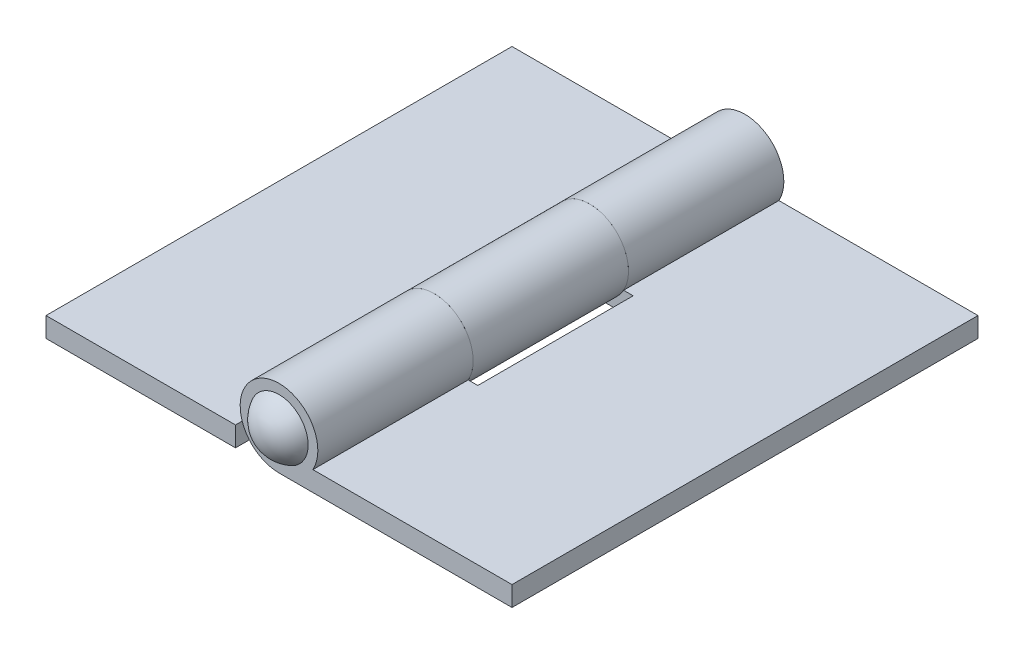
ISO-10303-21;
HEADER;
FILE_DESCRIPTION(('STEP AP214'),'2;1');
FILE_NAME('part.step','',(''),(''),'','','');
FILE_SCHEMA(('AUTOMOTIVE_DESIGN { 1 0 10303 214 1 1 1 1 }'));
ENDSEC;
DATA;
#1=APPLICATION_CONTEXT('core data for automotive mechanical design processes');
#2=APPLICATION_PROTOCOL_DEFINITION('international standard','automotive_design',2000,#1);
#3=PRODUCT_CONTEXT('',#1,'mechanical');
#4=PRODUCT('Part','Part','',(#3));
#5=PRODUCT_RELATED_PRODUCT_CATEGORY('part','',(#4));
#6=PRODUCT_DEFINITION_FORMATION('','',#4);
#7=PRODUCT_DEFINITION_CONTEXT('part definition',#1,'design');
#8=PRODUCT_DEFINITION('design','',#6,#7);
#9=PRODUCT_DEFINITION_SHAPE('','',#8);
#10=(LENGTH_UNIT() NAMED_UNIT(*) SI_UNIT(.MILLI.,.METRE.));
#11=(NAMED_UNIT(*) PLANE_ANGLE_UNIT() SI_UNIT($,.RADIAN.));
#12=(NAMED_UNIT(*) SI_UNIT($,.STERADIAN.) SOLID_ANGLE_UNIT());
#13=UNCERTAINTY_MEASURE_WITH_UNIT(LENGTH_MEASURE(1.E-05),#10,'distance_accuracy_value','');
#14=(GEOMETRIC_REPRESENTATION_CONTEXT(3) GLOBAL_UNCERTAINTY_ASSIGNED_CONTEXT((#13)) GLOBAL_UNIT_ASSIGNED_CONTEXT((#10,
#11,#12)) REPRESENTATION_CONTEXT('',''));
#15=CARTESIAN_POINT('',(0.,0.,0.));
#16=DIRECTION('',(0.,0.,1.));
#17=DIRECTION('',(1.,0.,0.));
#18=AXIS2_PLACEMENT_3D('',#15,#16,#17);
#19=CARTESIAN_POINT('',(0.,0.,-17.8436537890625));
#20=DIRECTION('',(0.,0.,-1.));
#21=DIRECTION('',(1.,0.,0.));
#22=AXIS2_PLACEMENT_3D('',#19,#20,#21);
#23=SPHERICAL_SURFACE('',#22,2.6693862109375);
#24=CARTESIAN_POINT('',(0.,0.,-19.05));
#25=DIRECTION('',(0.,0.,-1.));
#26=DIRECTION('',(-1.,0.,0.));
#27=AXIS2_PLACEMENT_3D('',#24,#25,#26);
#28=CIRCLE('',#27,2.38125);
#29=CARTESIAN_POINT('',(-2.38125,0.,-19.05));
#30=VERTEX_POINT('',#29);
#31=EDGE_CURVE('E54',#30,#30,#28,.T.);
#32=ORIENTED_EDGE('',*,*,#31,.T.);
#33=EDGE_LOOP('',(#32));
#34=FACE_BOUND('',#33,.T.);
#35=ADVANCED_FACE('F40',(#34),#23,.T.);
#36=CARTESIAN_POINT('',(0.,0.,17.8436537890625));
#37=DIRECTION('',(0.,0.,-1.));
#38=DIRECTION('',(-1.,0.,0.));
#39=AXIS2_PLACEMENT_3D('',#36,#37,#38);
#40=SPHERICAL_SURFACE('',#39,2.6693862109375);
#41=CARTESIAN_POINT('',(0.,0.,19.05));
#42=DIRECTION('',(0.,0.,-1.));
#43=DIRECTION('',(-1.,0.,0.));
#44=AXIS2_PLACEMENT_3D('',#41,#42,#43);
#45=CIRCLE('',#44,2.38125);
#46=CARTESIAN_POINT('',(-2.38125,0.,19.05));
#47=VERTEX_POINT('',#46);
#48=EDGE_CURVE('E11',#47,#47,#45,.T.);
#49=ORIENTED_EDGE('',*,*,#48,.F.);
#50=EDGE_LOOP('',(#49));
#51=FACE_BOUND('',#50,.T.);
#52=ADVANCED_FACE('F72',(#51),#40,.T.);
#53=CARTESIAN_POINT('',(-1.5875,0.,19.05));
#54=DIRECTION('',(0.,0.,-1.));
#55=DIRECTION('',(-1.,0.,0.));
#56=AXIS2_PLACEMENT_3D('',#53,#54,#55);
#57=PLANE('',#56);
#58=ORIENTED_EDGE('',*,*,#48,.T.);
#59=EDGE_LOOP('',(#58));
#60=FACE_BOUND('',#59,.T.);
#61=CARTESIAN_POINT('',(0.,0.,19.05));
#62=DIRECTION('',(0.,0.,-1.));
#63=DIRECTION('',(-1.,0.,0.));
#64=AXIS2_PLACEMENT_3D('',#61,#62,#63);
#65=CIRCLE('',#64,1.5875);
#66=CARTESIAN_POINT('',(-1.5875,0.,19.05));
#67=VERTEX_POINT('',#66);
#68=EDGE_CURVE('E46',#67,#67,#65,.T.);
#69=ORIENTED_EDGE('',*,*,#68,.F.);
#70=EDGE_LOOP('',(#69));
#71=FACE_BOUND('',#70,.T.);
#72=ADVANCED_FACE('F69',(#60,#71),#57,.T.);
#73=CARTESIAN_POINT('',(0.,0.,-20.51304));
#74=DIRECTION('',(0.,0.,-1.));
#75=DIRECTION('',(-1.,0.,0.));
#76=AXIS2_PLACEMENT_3D('',#73,#74,#75);
#77=CYLINDRICAL_SURFACE('',#76,1.5875);
#78=ORIENTED_EDGE('',*,*,#68,.T.);
#79=EDGE_LOOP('',(#78));
#80=FACE_BOUND('',#79,.T.);
#81=CARTESIAN_POINT('',(0.,0.,-19.05));
#82=DIRECTION('',(0.,0.,-1.));
#83=DIRECTION('',(-1.,0.,0.));
#84=AXIS2_PLACEMENT_3D('',#81,#82,#83);
#85=CIRCLE('',#84,1.5875);
#86=CARTESIAN_POINT('',(-1.5875,0.,-19.05));
#87=VERTEX_POINT('',#86);
#88=EDGE_CURVE('E50',#87,#87,#85,.T.);
#89=ORIENTED_EDGE('',*,*,#88,.F.);
#90=EDGE_LOOP('',(#89));
#91=FACE_BOUND('',#90,.T.);
#92=ADVANCED_FACE('F63',(#80,#91),#77,.T.);
#93=CARTESIAN_POINT('',(-2.38125,0.,-19.05));
#94=DIRECTION('',(0.,0.,1.));
#95=DIRECTION('',(1.,0.,0.));
#96=AXIS2_PLACEMENT_3D('',#93,#94,#95);
#97=PLANE('',#96);
#98=ORIENTED_EDGE('',*,*,#88,.T.);
#99=EDGE_LOOP('',(#98));
#100=FACE_BOUND('',#99,.T.);
#101=ORIENTED_EDGE('',*,*,#31,.F.);
#102=EDGE_LOOP('',(#101));
#103=FACE_BOUND('',#102,.T.);
#104=ADVANCED_FACE('F61',(#100,#103),#97,.T.);
#105=CLOSED_SHELL('',(#35,#52,#72,#92,#104));
#106=MANIFOLD_SOLID_BREP('B2',#105);
#107=CARTESIAN_POINT('',(-3.556,-1.54940000000001,19.05));
#108=DIRECTION('',(-1.,0.,0.));
#109=DIRECTION('',(0.,-1.,0.));
#110=AXIS2_PLACEMENT_3D('',#107,#108,#109);
#111=PLANE('',#110);
#112=DIRECTION('',(0.,-1.,0.));
#113=VECTOR('',#112,1.);
#114=CARTESIAN_POINT('',(-3.556,-1.54940000000001,6.35));
#115=LINE('',#114,#113);
#116=CARTESIAN_POINT('',(-3.556,-1.54940000000001,6.35));
#117=VERTEX_POINT('',#116);
#118=CARTESIAN_POINT('',(-3.556,-3.17500000000001,6.35));
#119=VERTEX_POINT('',#118);
#120=EDGE_CURVE('E216',#117,#119,#115,.T.);
#121=ORIENTED_EDGE('',*,*,#120,.F.);
#122=DIRECTION('',(0.,0.,-1.));
#123=VECTOR('',#122,1.);
#124=CARTESIAN_POINT('',(-3.556,-1.54940000000001,19.05));
#125=LINE('',#124,#123);
#126=CARTESIAN_POINT('',(-3.556,-1.54940000000001,19.05));
#127=VERTEX_POINT('',#126);
#128=EDGE_CURVE('E254',#127,#117,#125,.T.);
#129=ORIENTED_EDGE('',*,*,#128,.F.);
#130=DIRECTION('',(0.,1.,0.));
#131=VECTOR('',#130,1.);
#132=CARTESIAN_POINT('',(-3.556,-1.54940000000001,19.05));
#133=LINE('',#132,#131);
#134=CARTESIAN_POINT('',(-3.556,-3.17500000000001,19.05));
#135=VERTEX_POINT('',#134);
#136=EDGE_CURVE('E273',#135,#127,#133,.T.);
#137=ORIENTED_EDGE('',*,*,#136,.F.);
#138=DIRECTION('',(0.,0.,-1.));
#139=VECTOR('',#138,1.);
#140=CARTESIAN_POINT('',(-3.556,-3.17500000000001,19.05));
#141=LINE('',#140,#139);
#142=EDGE_CURVE('E129',#135,#119,#141,.T.);
#143=ORIENTED_EDGE('',*,*,#142,.T.);
#144=EDGE_LOOP('',(#121,#129,#137,#143));
#145=FACE_BOUND('',#144,.T.);
#146=ADVANCED_FACE('F120',(#145),#111,.F.);
#147=CARTESIAN_POINT('',(-19.05,-1.54940000000001,19.05));
#148=DIRECTION('',(1.,0.,0.));
#149=DIRECTION('',(0.,0.,-1.));
#150=AXIS2_PLACEMENT_3D('',#147,#148,#149);
#151=PLANE('',#150);
#152=DIRECTION('',(0.,-1.,0.));
#153=VECTOR('',#152,1.);
#154=CARTESIAN_POINT('',(-19.05,-1.54940000000001,-19.05));
#155=LINE('',#154,#153);
#156=CARTESIAN_POINT('',(-19.05,-1.54940000000001,-19.05));
#157=VERTEX_POINT('',#156);
#158=CARTESIAN_POINT('',(-19.05,-3.17500000000001,-19.05));
#159=VERTEX_POINT('',#158);
#160=EDGE_CURVE('E280',#157,#159,#155,.T.);
#161=ORIENTED_EDGE('',*,*,#160,.T.);
#162=DIRECTION('',(0.,0.,-1.));
#163=VECTOR('',#162,1.);
#164=CARTESIAN_POINT('',(-19.05,-3.17500000000001,19.05));
#165=LINE('',#164,#163);
#166=CARTESIAN_POINT('',(-19.05,-3.17500000000001,19.05));
#167=VERTEX_POINT('',#166);
#168=EDGE_CURVE('E38',#167,#159,#165,.T.);
#169=ORIENTED_EDGE('',*,*,#168,.F.);
#170=DIRECTION('',(0.,-1.,0.));
#171=VECTOR('',#170,1.);
#172=CARTESIAN_POINT('',(-19.05,-1.54940000000001,19.05));
#173=LINE('',#172,#171);
#174=CARTESIAN_POINT('',(-19.05,-1.54940000000001,19.05));
#175=VERTEX_POINT('',#174);
#176=EDGE_CURVE('E276',#175,#167,#173,.T.);
#177=ORIENTED_EDGE('',*,*,#176,.F.);
#178=DIRECTION('',(0.,0.,-1.));
#179=VECTOR('',#178,1.);
#180=CARTESIAN_POINT('',(-19.05,-1.54940000000001,19.05));
#181=LINE('',#180,#179);
#182=EDGE_CURVE('E255',#175,#157,#181,.T.);
#183=ORIENTED_EDGE('',*,*,#182,.T.);
#184=EDGE_LOOP('',(#161,#169,#177,#183));
#185=FACE_BOUND('',#184,.T.);
#186=ADVANCED_FACE('F122',(#185),#151,.F.);
#187=CARTESIAN_POINT('',(-19.05,-3.17500000000001,19.05));
#188=DIRECTION('',(0.,1.,0.));
#189=DIRECTION('',(0.,0.,1.));
#190=AXIS2_PLACEMENT_3D('',#187,#188,#189);
#191=PLANE('',#190);
#192=DIRECTION('',(1.,0.,0.));
#193=VECTOR('',#192,1.);
#194=CARTESIAN_POINT('',(-19.05,-3.17500000000001,-19.05));
#195=LINE('',#194,#193);
#196=CARTESIAN_POINT('',(-3.556,-3.17500000000001,-19.05));
#197=VERTEX_POINT('',#196);
#198=EDGE_CURVE('E283',#159,#197,#195,.T.);
#199=ORIENTED_EDGE('',*,*,#198,.T.);
#200=CARTESIAN_POINT('',(-3.556,-3.17500000000001,-6.34999999999998));
#201=VERTEX_POINT('',#200);
#202=EDGE_CURVE('E258',#201,#197,#141,.T.);
#203=ORIENTED_EDGE('',*,*,#202,.F.);
#204=DIRECTION('',(1.,0.,0.));
#205=VECTOR('',#204,1.);
#206=CARTESIAN_POINT('',(-3.556,-3.17500000000001,-6.35));
#207=LINE('',#206,#205);
#208=CARTESIAN_POINT('',(0.,-3.17500000000001,-6.35));
#209=VERTEX_POINT('',#208);
#210=EDGE_CURVE('E137',#201,#209,#207,.T.);
#211=ORIENTED_EDGE('',*,*,#210,.T.);
#212=DIRECTION('',(0.,0.,-1.));
#213=VECTOR('',#212,1.);
#214=CARTESIAN_POINT('',(0.,-3.17500000000001,15.603586385829));
#215=LINE('',#214,#213);
#216=CARTESIAN_POINT('',(0.,-3.17500000000001,6.35));
#217=VERTEX_POINT('',#216);
#218=EDGE_CURVE('E194',#217,#209,#215,.T.);
#219=ORIENTED_EDGE('',*,*,#218,.F.);
#220=DIRECTION('',(1.,0.,0.));
#221=VECTOR('',#220,1.);
#222=CARTESIAN_POINT('',(-3.556,-3.17500000000001,6.35));
#223=LINE('',#222,#221);
#224=EDGE_CURVE('E199',#119,#217,#223,.T.);
#225=ORIENTED_EDGE('',*,*,#224,.F.);
#226=ORIENTED_EDGE('',*,*,#142,.F.);
#227=DIRECTION('',(1.,0.,0.));
#228=VECTOR('',#227,1.);
#229=CARTESIAN_POINT('',(-19.05,-3.17500000000001,19.05));
#230=LINE('',#229,#228);
#231=EDGE_CURVE('E173',#167,#135,#230,.T.);
#232=ORIENTED_EDGE('',*,*,#231,.F.);
#233=ORIENTED_EDGE('',*,*,#168,.T.);
#234=EDGE_LOOP('',(#199,#203,#211,#219,#225,#226,#232,#233));
#235=FACE_BOUND('',#234,.T.);
#236=ADVANCED_FACE('F197',(#235),#191,.F.);
#237=CARTESIAN_POINT('',(-3.556,-1.54940000000001,-6.35));
#238=VERTEX_POINT('',#237);
#239=CARTESIAN_POINT('',(-3.556,-1.54940000000001,-19.05));
#240=VERTEX_POINT('',#239);
#241=EDGE_CURVE('E246',#238,#240,#125,.T.);
#242=ORIENTED_EDGE('',*,*,#241,.F.);
#243=DIRECTION('',(0.,-1.,0.));
#244=VECTOR('',#243,1.);
#245=CARTESIAN_POINT('',(-3.556,-1.54940000000001,-6.35));
#246=LINE('',#245,#244);
#247=EDGE_CURVE('E239',#238,#201,#246,.T.);
#248=ORIENTED_EDGE('',*,*,#247,.T.);
#249=ORIENTED_EDGE('',*,*,#202,.T.);
#250=DIRECTION('',(0.,1.,0.));
#251=VECTOR('',#250,1.);
#252=CARTESIAN_POINT('',(-3.556,-1.54940000000001,-19.05));
#253=LINE('',#252,#251);
#254=EDGE_CURVE('E253',#197,#240,#253,.T.);
#255=ORIENTED_EDGE('',*,*,#254,.T.);
#256=EDGE_LOOP('',(#242,#248,#249,#255));
#257=FACE_BOUND('',#256,.T.);
#258=ADVANCED_FACE('F251',(#257),#111,.F.);
#259=CARTESIAN_POINT('',(-19.05,-1.54940000000001,19.05));
#260=DIRECTION('',(0.,-1.,0.));
#261=DIRECTION('',(0.,0.,-1.));
#262=AXIS2_PLACEMENT_3D('',#259,#260,#261);
#263=PLANE('',#262);
#264=DIRECTION('',(-1.,0.,0.));
#265=VECTOR('',#264,1.);
#266=CARTESIAN_POINT('',(-19.05,-1.54940000000001,-19.05));
#267=LINE('',#266,#265);
#268=EDGE_CURVE('E166',#240,#157,#267,.T.);
#269=ORIENTED_EDGE('',*,*,#268,.T.);
#270=ORIENTED_EDGE('',*,*,#182,.F.);
#271=DIRECTION('',(-1.,0.,0.));
#272=VECTOR('',#271,1.);
#273=CARTESIAN_POINT('',(-19.05,-1.54940000000001,19.05));
#274=LINE('',#273,#272);
#275=EDGE_CURVE('E146',#127,#175,#274,.T.);
#276=ORIENTED_EDGE('',*,*,#275,.F.);
#277=ORIENTED_EDGE('',*,*,#128,.T.);
#278=DIRECTION('',(-1.,0.,0.));
#279=VECTOR('',#278,1.);
#280=CARTESIAN_POINT('',(-2.77127852082752,-1.5494,6.35));
#281=LINE('',#280,#279);
#282=CARTESIAN_POINT('',(-2.77127852082752,-1.5494,6.35));
#283=VERTEX_POINT('',#282);
#284=EDGE_CURVE('E212',#283,#117,#281,.T.);
#285=ORIENTED_EDGE('',*,*,#284,.F.);
#286=DIRECTION('',(0.,0.,-1.));
#287=VECTOR('',#286,1.);
#288=CARTESIAN_POINT('',(-2.77127852082752,-1.5494,15.603586385829));
#289=LINE('',#288,#287);
#290=CARTESIAN_POINT('',(-2.77127852082752,-1.5494,-6.35));
#291=VERTEX_POINT('',#290);
#292=EDGE_CURVE('E204',#283,#291,#289,.T.);
#293=ORIENTED_EDGE('',*,*,#292,.T.);
#294=DIRECTION('',(-1.,0.,0.));
#295=VECTOR('',#294,1.);
#296=CARTESIAN_POINT('',(-2.77127852082752,-1.5494,-6.35));
#297=LINE('',#296,#295);
#298=EDGE_CURVE('E235',#291,#238,#297,.T.);
#299=ORIENTED_EDGE('',*,*,#298,.T.);
#300=ORIENTED_EDGE('',*,*,#241,.T.);
#301=EDGE_LOOP('',(#269,#270,#276,#277,#285,#293,#299,#300));
#302=FACE_BOUND('',#301,.T.);
#303=ADVANCED_FACE('F244',(#302),#263,.F.);
#304=CARTESIAN_POINT('',(-19.05,-3.17500000000001,19.05));
#305=DIRECTION('',(0.,0.,1.));
#306=DIRECTION('',(1.,0.,0.));
#307=AXIS2_PLACEMENT_3D('',#304,#305,#306);
#308=PLANE('',#307);
#309=ORIENTED_EDGE('',*,*,#176,.T.);
#310=ORIENTED_EDGE('',*,*,#231,.T.);
#311=ORIENTED_EDGE('',*,*,#136,.T.);
#312=ORIENTED_EDGE('',*,*,#275,.T.);
#313=EDGE_LOOP('',(#309,#310,#311,#312));
#314=FACE_BOUND('',#313,.T.);
#315=ADVANCED_FACE('F287',(#314),#308,.T.);
#316=CARTESIAN_POINT('',(-19.05,-3.17500000000001,-19.05));
#317=DIRECTION('',(0.,0.,1.));
#318=DIRECTION('',(1.,0.,0.));
#319=AXIS2_PLACEMENT_3D('',#316,#317,#318);
#320=PLANE('',#319);
#321=ORIENTED_EDGE('',*,*,#160,.F.);
#322=ORIENTED_EDGE('',*,*,#268,.F.);
#323=ORIENTED_EDGE('',*,*,#254,.F.);
#324=ORIENTED_EDGE('',*,*,#198,.F.);
#325=EDGE_LOOP('',(#321,#322,#323,#324));
#326=FACE_BOUND('',#325,.T.);
#327=ADVANCED_FACE('F291',(#326),#320,.F.);
#328=CARTESIAN_POINT('',(0.,0.,15.603586385829));
#329=DIRECTION('',(0.,0.,-1.));
#330=DIRECTION('',(-1.,0.,0.));
#331=AXIS2_PLACEMENT_3D('',#328,#329,#330);
#332=CYLINDRICAL_SURFACE('',#331,3.175);
#333=CARTESIAN_POINT('',(0.,0.,6.35));
#334=DIRECTION('',(0.,0.,1.));
#335=DIRECTION('',(1.,0.,0.));
#336=AXIS2_PLACEMENT_3D('',#333,#334,#335);
#337=CIRCLE('',#336,3.175);
#338=EDGE_CURVE('E208',#217,#283,#337,.T.);
#339=ORIENTED_EDGE('',*,*,#338,.F.);
#340=ORIENTED_EDGE('',*,*,#218,.T.);
#341=CARTESIAN_POINT('',(0.,0.,-6.35));
#342=DIRECTION('',(0.,0.,1.));
#343=DIRECTION('',(1.,0.,0.));
#344=AXIS2_PLACEMENT_3D('',#341,#342,#343);
#345=CIRCLE('',#344,3.175);
#346=EDGE_CURVE('E233',#209,#291,#345,.T.);
#347=ORIENTED_EDGE('',*,*,#346,.T.);
#348=ORIENTED_EDGE('',*,*,#292,.F.);
#349=EDGE_LOOP('',(#339,#340,#347,#348));
#350=FACE_BOUND('',#349,.T.);
#351=ADVANCED_FACE('F209',(#350),#332,.T.);
#352=CARTESIAN_POINT('',(0.,0.,-6.35));
#353=DIRECTION('',(0.,0.,1.));
#354=DIRECTION('',(1.,0.,0.));
#355=AXIS2_PLACEMENT_3D('',#352,#353,#354);
#356=PLANE('',#355);
#357=ORIENTED_EDGE('',*,*,#346,.F.);
#358=ORIENTED_EDGE('',*,*,#210,.F.);
#359=ORIENTED_EDGE('',*,*,#247,.F.);
#360=ORIENTED_EDGE('',*,*,#298,.F.);
#361=EDGE_LOOP('',(#357,#358,#359,#360));
#362=FACE_BOUND('',#361,.T.);
#363=CARTESIAN_POINT('',(0.,0.,-6.35));
#364=DIRECTION('',(0.,0.,1.));
#365=DIRECTION('',(1.,0.,0.));
#366=AXIS2_PLACEMENT_3D('',#363,#364,#365);
#367=CIRCLE('',#366,1.5875);
#368=CARTESIAN_POINT('',(1.5875,0.,-6.35));
#369=VERTEX_POINT('',#368);
#370=EDGE_CURVE('E211',#369,#369,#367,.T.);
#371=ORIENTED_EDGE('',*,*,#370,.T.);
#372=EDGE_LOOP('',(#371));
#373=FACE_BOUND('',#372,.T.);
#374=ADVANCED_FACE('F248',(#362,#373),#356,.F.);
#375=CARTESIAN_POINT('',(0.,0.,15.603586385829));
#376=DIRECTION('',(0.,0.,-1.));
#377=DIRECTION('',(-1.,0.,0.));
#378=AXIS2_PLACEMENT_3D('',#375,#376,#377);
#379=CYLINDRICAL_SURFACE('',#378,1.5875);
#380=ORIENTED_EDGE('',*,*,#370,.F.);
#381=EDGE_LOOP('',(#380));
#382=FACE_BOUND('',#381,.T.);
#383=CARTESIAN_POINT('',(0.,0.,6.35));
#384=DIRECTION('',(0.,0.,1.));
#385=DIRECTION('',(1.,0.,0.));
#386=AXIS2_PLACEMENT_3D('',#383,#384,#385);
#387=CIRCLE('',#386,1.5875);
#388=CARTESIAN_POINT('',(1.5875,0.,6.35));
#389=VERTEX_POINT('',#388);
#390=EDGE_CURVE('E218',#389,#389,#387,.T.);
#391=ORIENTED_EDGE('',*,*,#390,.T.);
#392=EDGE_LOOP('',(#391));
#393=FACE_BOUND('',#392,.T.);
#394=ADVANCED_FACE('F360',(#382,#393),#379,.F.);
#395=CARTESIAN_POINT('',(-3.55599999999999,-3.17500000000001,6.35));
#396=DIRECTION('',(0.,0.,1.));
#397=DIRECTION('',(1.,0.,0.));
#398=AXIS2_PLACEMENT_3D('',#395,#396,#397);
#399=PLANE('',#398);
#400=ORIENTED_EDGE('',*,*,#390,.F.);
#401=EDGE_LOOP('',(#400));
#402=FACE_BOUND('',#401,.T.);
#403=ORIENTED_EDGE('',*,*,#224,.T.);
#404=ORIENTED_EDGE('',*,*,#338,.T.);
#405=ORIENTED_EDGE('',*,*,#284,.T.);
#406=ORIENTED_EDGE('',*,*,#120,.T.);
#407=EDGE_LOOP('',(#403,#404,#405,#406));
#408=FACE_BOUND('',#407,.T.);
#409=ADVANCED_FACE('F214',(#402,#408),#399,.T.);
#410=CLOSED_SHELL('',(#146,#186,#236,#258,#303,#315,#327,#351,#374,#394,#409));
#411=MANIFOLD_SOLID_BREP('B6',#410);
#412=CARTESIAN_POINT('',(0.,0.,19.05));
#413=DIRECTION('',(0.,0.,-1.));
#414=DIRECTION('',(-1.,0.,0.));
#415=AXIS2_PLACEMENT_3D('',#412,#413,#414);
#416=CYLINDRICAL_SURFACE('',#415,3.175);
#417=CARTESIAN_POINT('',(0.,0.,6.35));
#418=DIRECTION('',(0.,0.,1.));
#419=DIRECTION('',(1.,0.,0.));
#420=AXIS2_PLACEMENT_3D('',#417,#418,#419);
#421=CIRCLE('',#420,3.175);
#422=CARTESIAN_POINT('',(2.77127852082752,-1.5494,6.35));
#423=VERTEX_POINT('',#422);
#424=CARTESIAN_POINT('',(0.,-3.17500000000001,6.35));
#425=VERTEX_POINT('',#424);
#426=EDGE_CURVE('E492',#423,#425,#421,.T.);
#427=ORIENTED_EDGE('',*,*,#426,.T.);
#428=DIRECTION('',(0.,0.,-1.));
#429=VECTOR('',#428,1.);
#430=CARTESIAN_POINT('',(0.,-3.175,19.05));
#431=LINE('',#430,#429);
#432=CARTESIAN_POINT('',(0.,-3.175,19.05));
#433=VERTEX_POINT('',#432);
#434=EDGE_CURVE('E526',#433,#425,#431,.T.);
#435=ORIENTED_EDGE('',*,*,#434,.F.);
#436=CARTESIAN_POINT('',(0.,0.,19.05));
#437=DIRECTION('',(0.,0.,1.));
#438=DIRECTION('',(-1.,0.,0.));
#439=AXIS2_PLACEMENT_3D('',#436,#437,#438);
#440=CIRCLE('',#439,3.175);
#441=CARTESIAN_POINT('',(2.77127852082752,-1.5494,19.05));
#442=VERTEX_POINT('',#441);
#443=EDGE_CURVE('E511',#442,#433,#440,.T.);
#444=ORIENTED_EDGE('',*,*,#443,.F.);
#445=DIRECTION('',(0.,0.,-1.));
#446=VECTOR('',#445,1.);
#447=CARTESIAN_POINT('',(2.77127852082752,-1.5494,19.05));
#448=LINE('',#447,#446);
#449=EDGE_CURVE('E401',#442,#423,#448,.T.);
#450=ORIENTED_EDGE('',*,*,#449,.T.);
#451=EDGE_LOOP('',(#427,#435,#444,#450));
#452=FACE_BOUND('',#451,.T.);
#453=ADVANCED_FACE('F392',(#452),#416,.T.);
#454=CARTESIAN_POINT('',(0.,0.,19.05));
#455=DIRECTION('',(0.,0.,-1.));
#456=DIRECTION('',(-1.,0.,0.));
#457=AXIS2_PLACEMENT_3D('',#454,#455,#456);
#458=CYLINDRICAL_SURFACE('',#457,1.5875);
#459=CARTESIAN_POINT('',(0.,0.,-6.35));
#460=DIRECTION('',(0.,0.,-1.));
#461=DIRECTION('',(-1.,0.,0.));
#462=AXIS2_PLACEMENT_3D('',#459,#460,#461);
#463=CIRCLE('',#462,1.5875);
#464=CARTESIAN_POINT('',(-1.5875,0.,-6.34999999999999));
#465=VERTEX_POINT('',#464);
#466=EDGE_CURVE('E396',#465,#465,#463,.T.);
#467=CARTESIAN_POINT('',(0.,0.,-19.05));
#468=DIRECTION('',(0.,0.,1.));
#469=DIRECTION('',(1.,0.,0.));
#470=AXIS2_PLACEMENT_3D('',#467,#468,#469);
#471=CIRCLE('',#470,1.5875);
#472=CARTESIAN_POINT('',(-1.5875,0.,-19.05));
#473=VERTEX_POINT('',#472);
#474=EDGE_CURVE('E501',#473,#473,#471,.T.);
#475=CARTESIAN_POINT('',(-1.5875,0.,-6.34999999999999));
#476=CARTESIAN_POINT('',(-1.5875,0.,-6.48229166666666));
#477=CARTESIAN_POINT('',(-1.5875,0.,-6.61458333333333));
#478=CARTESIAN_POINT('',(-1.5875,0.,-6.87916666666666));
#479=CARTESIAN_POINT('',(-1.5875,0.,-7.01145833333333));
#480=CARTESIAN_POINT('',(-1.5875,0.,-7.27604166666666));
#481=CARTESIAN_POINT('',(-1.5875,0.,-7.40833333333333));
#482=CARTESIAN_POINT('',(-1.5875,0.,-7.67291666666666));
#483=CARTESIAN_POINT('',(-1.5875,0.,-7.80520833333333));
#484=CARTESIAN_POINT('',(-1.5875,0.,-8.06979166666666));
#485=CARTESIAN_POINT('',(-1.5875,0.,-8.20208333333333));
#486=CARTESIAN_POINT('',(-1.5875,0.,-8.46666666666666));
#487=CARTESIAN_POINT('',(-1.5875,0.,-8.59895833333333));
#488=CARTESIAN_POINT('',(-1.5875,0.,-8.86354166666666));
#489=CARTESIAN_POINT('',(-1.5875,0.,-8.99583333333333));
#490=CARTESIAN_POINT('',(-1.5875,0.,-9.26041666666666));
#491=CARTESIAN_POINT('',(-1.5875,0.,-9.39270833333333));
#492=CARTESIAN_POINT('',(-1.5875,0.,-9.65729166666666));
#493=CARTESIAN_POINT('',(-1.5875,0.,-9.78958333333333));
#494=CARTESIAN_POINT('',(-1.5875,0.,-10.0541666666667));
#495=CARTESIAN_POINT('',(-1.5875,0.,-10.1864583333333));
#496=CARTESIAN_POINT('',(-1.5875,0.,-10.4510416666667));
#497=CARTESIAN_POINT('',(-1.5875,0.,-10.5833333333333));
#498=CARTESIAN_POINT('',(-1.5875,0.,-10.8479166666667));
#499=CARTESIAN_POINT('',(-1.5875,0.,-10.9802083333333));
#500=CARTESIAN_POINT('',(-1.5875,0.,-11.2447916666667));
#501=CARTESIAN_POINT('',(-1.5875,0.,-11.3770833333333));
#502=CARTESIAN_POINT('',(-1.5875,0.,-11.6416666666667));
#503=CARTESIAN_POINT('',(-1.5875,0.,-11.7739583333333));
#504=CARTESIAN_POINT('',(-1.5875,0.,-12.0385416666667));
#505=CARTESIAN_POINT('',(-1.5875,0.,-12.1708333333333));
#506=CARTESIAN_POINT('',(-1.5875,0.,-12.4354166666667));
#507=CARTESIAN_POINT('',(-1.5875,0.,-12.5677083333333));
#508=CARTESIAN_POINT('',(-1.5875,0.,-12.8322916666667));
#509=CARTESIAN_POINT('',(-1.5875,0.,-12.9645833333333));
#510=CARTESIAN_POINT('',(-1.5875,0.,-13.2291666666667));
#511=CARTESIAN_POINT('',(-1.5875,0.,-13.3614583333333));
#512=CARTESIAN_POINT('',(-1.5875,0.,-13.6260416666667));
#513=CARTESIAN_POINT('',(-1.5875,0.,-13.7583333333333));
#514=CARTESIAN_POINT('',(-1.5875,0.,-14.0229166666667));
#515=CARTESIAN_POINT('',(-1.5875,0.,-14.1552083333333));
#516=CARTESIAN_POINT('',(-1.5875,0.,-14.4197916666667));
#517=CARTESIAN_POINT('',(-1.5875,0.,-14.5520833333333));
#518=CARTESIAN_POINT('',(-1.5875,0.,-14.8166666666667));
#519=CARTESIAN_POINT('',(-1.5875,0.,-14.9489583333333));
#520=CARTESIAN_POINT('',(-1.5875,0.,-15.2135416666667));
#521=CARTESIAN_POINT('',(-1.5875,0.,-15.3458333333333));
#522=CARTESIAN_POINT('',(-1.5875,0.,-15.6104166666667));
#523=CARTESIAN_POINT('',(-1.5875,0.,-15.7427083333333));
#524=CARTESIAN_POINT('',(-1.5875,0.,-16.0072916666667));
#525=CARTESIAN_POINT('',(-1.5875,0.,-16.1395833333333));
#526=CARTESIAN_POINT('',(-1.5875,0.,-16.4041666666667));
#527=CARTESIAN_POINT('',(-1.5875,0.,-16.5364583333333));
#528=CARTESIAN_POINT('',(-1.5875,0.,-16.8010416666667));
#529=CARTESIAN_POINT('',(-1.5875,0.,-16.9333333333333));
#530=CARTESIAN_POINT('',(-1.5875,0.,-17.1979166666667));
#531=CARTESIAN_POINT('',(-1.5875,0.,-17.3302083333333));
#532=CARTESIAN_POINT('',(-1.5875,0.,-17.5947916666667));
#533=CARTESIAN_POINT('',(-1.5875,0.,-17.7270833333333));
#534=CARTESIAN_POINT('',(-1.5875,0.,-17.9916666666667));
#535=CARTESIAN_POINT('',(-1.5875,0.,-18.1239583333333));
#536=CARTESIAN_POINT('',(-1.5875,0.,-18.3885416666667));
#537=CARTESIAN_POINT('',(-1.5875,0.,-18.5208333333333));
#538=CARTESIAN_POINT('',(-1.5875,0.,-18.7854166666667));
#539=CARTESIAN_POINT('',(-1.5875,0.,-18.9177083333333));
#540=CARTESIAN_POINT('',(-1.5875,0.,-19.05));
#541=B_SPLINE_CURVE_WITH_KNOTS('',3,(#475,#476,#477,#478,#479,#480,#481,#482,#483,#484,#485,
#486,#487,#488,#489,#490,#491,#492,#493,#494,#495,#496,#497,#498,#499,#500,#501,#502,#503,#504,
#505,#506,#507,#508,#509,#510,#511,#512,#513,#514,#515,#516,#517,#518,#519,#520,#521,#522,#523,
#524,#525,#526,#527,#528,#529,#530,#531,#532,#533,#534,#535,#536,#537,#538,#539,#540),
.UNSPECIFIED.,.F.,.F.,(4,2,2,2,2,2,2,2,2,2,2,2,2,2,2,2,2,2,2,2,2,2,2,2,2,2,2,2,2,2,2,2,4),(0.,
0.396875000000001,0.793749999999999,1.190625,1.5875,1.984375,2.38125,2.778125,3.175,3.571875,
3.96875,4.365625,4.7625,5.159375,5.55625000000001,5.953125,6.35,6.746875,7.14375,7.540625,
7.9375,8.334375,8.73125,9.128125,9.525,9.921875,10.31875,10.715625,11.1125,11.509375,11.90625,
12.303125,12.7),.UNSPECIFIED.);
#542=EDGE_CURVE('BSEAM540',#465,#473,#541,.T.);
#543=ORIENTED_EDGE('',*,*,#466,.F.);
#544=ORIENTED_EDGE('',*,*,#474,.F.);
#545=ORIENTED_EDGE('',*,*,#542,.T.);
#546=ORIENTED_EDGE('',*,*,#542,.F.);
#547=EDGE_LOOP('',(#543,#545,#544,#546));
#548=FACE_BOUND('',#547,.T.);
#549=ADVANCED_FACE('F540',(#548),#458,.F.);
#550=CARTESIAN_POINT('',(0.,0.,19.05));
#551=DIRECTION('',(0.,0.,-1.));
#552=DIRECTION('',(-1.,0.,0.));
#553=AXIS2_PLACEMENT_3D('',#550,#551,#552);
#554=PLANE('',#553);
#555=DIRECTION('',(0.,1.,0.));
#556=VECTOR('',#555,1.);
#557=CARTESIAN_POINT('',(19.05,-3.175,19.05));
#558=LINE('',#557,#556);
#559=CARTESIAN_POINT('',(19.05,-3.175,19.05));
#560=VERTEX_POINT('',#559);
#561=CARTESIAN_POINT('',(19.05,-1.5494,19.05));
#562=VERTEX_POINT('',#561);
#563=EDGE_CURVE('E508',#560,#562,#558,.T.);
#564=ORIENTED_EDGE('',*,*,#563,.T.);
#565=DIRECTION('',(-1.,0.,0.));
#566=VECTOR('',#565,1.);
#567=CARTESIAN_POINT('',(19.05,-1.5494,19.05));
#568=LINE('',#567,#566);
#569=EDGE_CURVE('E445',#562,#442,#568,.T.);
#570=ORIENTED_EDGE('',*,*,#569,.T.);
#571=ORIENTED_EDGE('',*,*,#443,.T.);
#572=DIRECTION('',(1.,0.,0.));
#573=VECTOR('',#572,1.);
#574=CARTESIAN_POINT('',(19.05,-3.175,19.05));
#575=LINE('',#574,#573);
#576=EDGE_CURVE('E418',#433,#560,#575,.T.);
#577=ORIENTED_EDGE('',*,*,#576,.T.);
#578=EDGE_LOOP('',(#564,#570,#571,#577));
#579=FACE_BOUND('',#578,.T.);
#580=CARTESIAN_POINT('',(0.,0.,19.05));
#581=DIRECTION('',(0.,0.,1.));
#582=DIRECTION('',(1.,0.,0.));
#583=AXIS2_PLACEMENT_3D('',#580,#581,#582);
#584=CIRCLE('',#583,1.5875);
#585=CARTESIAN_POINT('',(-1.5875,0.,19.05));
#586=VERTEX_POINT('',#585);
#587=EDGE_CURVE('E502',#586,#586,#584,.T.);
#588=ORIENTED_EDGE('',*,*,#587,.F.);
#589=EDGE_LOOP('',(#588));
#590=FACE_BOUND('',#589,.T.);
#591=ADVANCED_FACE('F543',(#579,#590),#554,.F.);
#592=CARTESIAN_POINT('',(0.,0.,-19.05));
#593=DIRECTION('',(0.,0.,-1.));
#594=DIRECTION('',(-1.,0.,0.));
#595=AXIS2_PLACEMENT_3D('',#592,#593,#594);
#596=PLANE('',#595);
#597=DIRECTION('',(0.,1.,0.));
#598=VECTOR('',#597,1.);
#599=CARTESIAN_POINT('',(19.05,-3.175,-19.05));
#600=LINE('',#599,#598);
#601=CARTESIAN_POINT('',(19.05,-3.175,-19.05));
#602=VERTEX_POINT('',#601);
#603=CARTESIAN_POINT('',(19.05,-1.5494,-19.05));
#604=VERTEX_POINT('',#603);
#605=EDGE_CURVE('E505',#602,#604,#600,.T.);
#606=ORIENTED_EDGE('',*,*,#605,.F.);
#607=DIRECTION('',(1.,0.,0.));
#608=VECTOR('',#607,1.);
#609=CARTESIAN_POINT('',(19.05,-3.175,-19.05));
#610=LINE('',#609,#608);
#611=CARTESIAN_POINT('',(0.,-3.175,-19.05));
#612=VERTEX_POINT('',#611);
#613=EDGE_CURVE('E438',#612,#602,#610,.T.);
#614=ORIENTED_EDGE('',*,*,#613,.F.);
#615=CARTESIAN_POINT('',(0.,0.,-19.05));
#616=DIRECTION('',(0.,0.,1.));
#617=DIRECTION('',(-1.,0.,0.));
#618=AXIS2_PLACEMENT_3D('',#615,#616,#617);
#619=CIRCLE('',#618,3.175);
#620=CARTESIAN_POINT('',(2.77127852082752,-1.5494,-19.05));
#621=VERTEX_POINT('',#620);
#622=EDGE_CURVE('E520',#621,#612,#619,.T.);
#623=ORIENTED_EDGE('',*,*,#622,.F.);
#624=DIRECTION('',(-1.,0.,0.));
#625=VECTOR('',#624,1.);
#626=CARTESIAN_POINT('',(19.05,-1.5494,-19.05));
#627=LINE('',#626,#625);
#628=EDGE_CURVE('E517',#604,#621,#627,.T.);
#629=ORIENTED_EDGE('',*,*,#628,.F.);
#630=EDGE_LOOP('',(#606,#614,#623,#629));
#631=FACE_BOUND('',#630,.T.);
#632=ORIENTED_EDGE('',*,*,#474,.T.);
#633=EDGE_LOOP('',(#632));
#634=FACE_BOUND('',#633,.T.);
#635=ADVANCED_FACE('F545',(#631,#634),#596,.T.);
#636=CARTESIAN_POINT('',(19.05,-3.175,19.05));
#637=DIRECTION('',(-1.,0.,0.));
#638=DIRECTION('',(0.,0.,1.));
#639=AXIS2_PLACEMENT_3D('',#636,#637,#638);
#640=PLANE('',#639);
#641=ORIENTED_EDGE('',*,*,#605,.T.);
#642=DIRECTION('',(0.,0.,-1.));
#643=VECTOR('',#642,1.);
#644=CARTESIAN_POINT('',(19.05,-1.5494,19.05));
#645=LINE('',#644,#643);
#646=EDGE_CURVE('E118',#562,#604,#645,.T.);
#647=ORIENTED_EDGE('',*,*,#646,.F.);
#648=ORIENTED_EDGE('',*,*,#563,.F.);
#649=DIRECTION('',(0.,0.,-1.));
#650=VECTOR('',#649,1.);
#651=CARTESIAN_POINT('',(19.05,-3.175,19.05));
#652=LINE('',#651,#650);
#653=EDGE_CURVE('E514',#560,#602,#652,.T.);
#654=ORIENTED_EDGE('',*,*,#653,.T.);
#655=EDGE_LOOP('',(#641,#647,#648,#654));
#656=FACE_BOUND('',#655,.T.);
#657=ADVANCED_FACE('F394',(#656),#640,.F.);
#658=CARTESIAN_POINT('',(19.05,-1.5494,19.05));
#659=DIRECTION('',(0.,-1.,0.));
#660=DIRECTION('',(1.,0.,0.));
#661=AXIS2_PLACEMENT_3D('',#658,#659,#660);
#662=PLANE('',#661);
#663=CARTESIAN_POINT('',(2.77127852082752,-1.5494,-6.35));
#664=VERTEX_POINT('',#663);
#665=EDGE_CURVE('E528',#664,#621,#448,.T.);
#666=ORIENTED_EDGE('',*,*,#665,.F.);
#667=DIRECTION('',(1.,0.,0.));
#668=VECTOR('',#667,1.);
#669=CARTESIAN_POINT('',(19.05,-1.5494,-6.35));
#670=LINE('',#669,#668);
#671=CARTESIAN_POINT('',(3.55599999999999,-1.5494,-6.35));
#672=VERTEX_POINT('',#671);
#673=EDGE_CURVE('E498',#664,#672,#670,.T.);
#674=ORIENTED_EDGE('',*,*,#673,.T.);
#675=DIRECTION('',(0.,0.,1.));
#676=VECTOR('',#675,1.);
#677=CARTESIAN_POINT('',(3.55599999999999,-1.5494,19.05));
#678=LINE('',#677,#676);
#679=CARTESIAN_POINT('',(3.55599999999999,-1.5494,6.35));
#680=VERTEX_POINT('',#679);
#681=EDGE_CURVE('E470',#672,#680,#678,.T.);
#682=ORIENTED_EDGE('',*,*,#681,.T.);
#683=DIRECTION('',(-1.,0.,0.));
#684=VECTOR('',#683,1.);
#685=CARTESIAN_POINT('',(19.05,-1.5494,6.35));
#686=LINE('',#685,#684);
#687=EDGE_CURVE('E494',#680,#423,#686,.T.);
#688=ORIENTED_EDGE('',*,*,#687,.T.);
#689=ORIENTED_EDGE('',*,*,#449,.F.);
#690=ORIENTED_EDGE('',*,*,#569,.F.);
#691=ORIENTED_EDGE('',*,*,#646,.T.);
#692=ORIENTED_EDGE('',*,*,#628,.T.);
#693=EDGE_LOOP('',(#666,#674,#682,#688,#689,#690,#691,#692));
#694=FACE_BOUND('',#693,.T.);
#695=ADVANCED_FACE('F562',(#694),#662,.F.);
#696=CARTESIAN_POINT('',(0.,-3.17500000000001,-6.35));
#697=VERTEX_POINT('',#696);
#698=EDGE_CURVE('E525',#697,#612,#431,.T.);
#699=ORIENTED_EDGE('',*,*,#698,.F.);
#700=CARTESIAN_POINT('',(0.,0.,-6.35));
#701=DIRECTION('',(0.,0.,-1.));
#702=DIRECTION('',(-1.,0.,0.));
#703=AXIS2_PLACEMENT_3D('',#700,#701,#702);
#704=CIRCLE('',#703,3.175);
#705=EDGE_CURVE('E480',#697,#664,#704,.T.);
#706=ORIENTED_EDGE('',*,*,#705,.T.);
#707=ORIENTED_EDGE('',*,*,#665,.T.);
#708=ORIENTED_EDGE('',*,*,#622,.T.);
#709=EDGE_LOOP('',(#699,#706,#707,#708));
#710=FACE_BOUND('',#709,.T.);
#711=ADVANCED_FACE('F557',(#710),#416,.T.);
#712=CARTESIAN_POINT('',(19.05,-3.175,19.05));
#713=DIRECTION('',(0.,1.,0.));
#714=DIRECTION('',(-1.,0.,0.));
#715=AXIS2_PLACEMENT_3D('',#712,#713,#714);
#716=PLANE('',#715);
#717=DIRECTION('',(0.,0.,-1.));
#718=VECTOR('',#717,1.);
#719=CARTESIAN_POINT('',(3.55599999999999,-3.17500000000001,-6.35));
#720=LINE('',#719,#718);
#721=CARTESIAN_POINT('',(3.55599999999999,-3.175,6.35));
#722=VERTEX_POINT('',#721);
#723=CARTESIAN_POINT('',(3.55599999999999,-3.17500000000001,-6.35));
#724=VERTEX_POINT('',#723);
#725=EDGE_CURVE('E409',#722,#724,#720,.T.);
#726=ORIENTED_EDGE('',*,*,#725,.T.);
#727=DIRECTION('',(-1.,0.,0.));
#728=VECTOR('',#727,1.);
#729=CARTESIAN_POINT('',(-3.55599999999999,-3.17500000000001,-6.35));
#730=LINE('',#729,#728);
#731=EDGE_CURVE('E477',#724,#697,#730,.T.);
#732=ORIENTED_EDGE('',*,*,#731,.T.);
#733=ORIENTED_EDGE('',*,*,#698,.T.);
#734=ORIENTED_EDGE('',*,*,#613,.T.);
#735=ORIENTED_EDGE('',*,*,#653,.F.);
#736=ORIENTED_EDGE('',*,*,#576,.F.);
#737=ORIENTED_EDGE('',*,*,#434,.T.);
#738=DIRECTION('',(1.,0.,0.));
#739=VECTOR('',#738,1.);
#740=CARTESIAN_POINT('',(-3.55599999999999,-3.17500000000001,6.35));
#741=LINE('',#740,#739);
#742=EDGE_CURVE('E487',#425,#722,#741,.T.);
#743=ORIENTED_EDGE('',*,*,#742,.T.);
#744=EDGE_LOOP('',(#726,#732,#733,#734,#735,#736,#737,#743));
#745=FACE_BOUND('',#744,.T.);
#746=ADVANCED_FACE('F484',(#745),#716,.F.);
#747=CARTESIAN_POINT('',(0.,0.,6.35));
#748=DIRECTION('',(0.,0.,1.));
#749=DIRECTION('',(1.,0.,0.));
#750=AXIS2_PLACEMENT_3D('',#747,#748,#749);
#751=CIRCLE('',#750,1.5875);
#752=CARTESIAN_POINT('',(-1.5875,0.,6.35));
#753=VERTEX_POINT('',#752);
#754=EDGE_CURVE('E473',#753,#753,#751,.T.);
#755=CARTESIAN_POINT('',(-1.5875,0.,6.35));
#756=CARTESIAN_POINT('',(-1.5875,0.,6.48229166666666));
#757=CARTESIAN_POINT('',(-1.5875,0.,6.61458333333333));
#758=CARTESIAN_POINT('',(-1.5875,0.,6.87916666666666));
#759=CARTESIAN_POINT('',(-1.5875,0.,7.01145833333333));
#760=CARTESIAN_POINT('',(-1.5875,0.,7.27604166666666));
#761=CARTESIAN_POINT('',(-1.5875,0.,7.40833333333333));
#762=CARTESIAN_POINT('',(-1.5875,0.,7.67291666666666));
#763=CARTESIAN_POINT('',(-1.5875,0.,7.80520833333333));
#764=CARTESIAN_POINT('',(-1.5875,0.,8.06979166666666));
#765=CARTESIAN_POINT('',(-1.5875,0.,8.20208333333333));
#766=CARTESIAN_POINT('',(-1.5875,0.,8.46666666666666));
#767=CARTESIAN_POINT('',(-1.5875,0.,8.59895833333333));
#768=CARTESIAN_POINT('',(-1.5875,0.,8.86354166666666));
#769=CARTESIAN_POINT('',(-1.5875,0.,8.99583333333333));
#770=CARTESIAN_POINT('',(-1.5875,0.,9.26041666666666));
#771=CARTESIAN_POINT('',(-1.5875,0.,9.39270833333333));
#772=CARTESIAN_POINT('',(-1.5875,0.,9.65729166666666));
#773=CARTESIAN_POINT('',(-1.5875,0.,9.78958333333333));
#774=CARTESIAN_POINT('',(-1.5875,0.,10.0541666666667));
#775=CARTESIAN_POINT('',(-1.5875,0.,10.1864583333333));
#776=CARTESIAN_POINT('',(-1.5875,0.,10.4510416666667));
#777=CARTESIAN_POINT('',(-1.5875,0.,10.5833333333333));
#778=CARTESIAN_POINT('',(-1.5875,0.,10.8479166666667));
#779=CARTESIAN_POINT('',(-1.5875,0.,10.9802083333333));
#780=CARTESIAN_POINT('',(-1.5875,0.,11.2447916666667));
#781=CARTESIAN_POINT('',(-1.5875,0.,11.3770833333333));
#782=CARTESIAN_POINT('',(-1.5875,0.,11.6416666666667));
#783=CARTESIAN_POINT('',(-1.5875,0.,11.7739583333333));
#784=CARTESIAN_POINT('',(-1.5875,0.,12.0385416666667));
#785=CARTESIAN_POINT('',(-1.5875,0.,12.1708333333333));
#786=CARTESIAN_POINT('',(-1.5875,0.,12.4354166666667));
#787=CARTESIAN_POINT('',(-1.5875,0.,12.5677083333333));
#788=CARTESIAN_POINT('',(-1.5875,0.,12.8322916666667));
#789=CARTESIAN_POINT('',(-1.5875,0.,12.9645833333333));
#790=CARTESIAN_POINT('',(-1.5875,0.,13.2291666666667));
#791=CARTESIAN_POINT('',(-1.5875,0.,13.3614583333333));
#792=CARTESIAN_POINT('',(-1.5875,0.,13.6260416666667));
#793=CARTESIAN_POINT('',(-1.5875,0.,13.7583333333333));
#794=CARTESIAN_POINT('',(-1.5875,0.,14.0229166666667));
#795=CARTESIAN_POINT('',(-1.5875,0.,14.1552083333333));
#796=CARTESIAN_POINT('',(-1.5875,0.,14.4197916666667));
#797=CARTESIAN_POINT('',(-1.5875,0.,14.5520833333333));
#798=CARTESIAN_POINT('',(-1.5875,0.,14.8166666666667));
#799=CARTESIAN_POINT('',(-1.5875,0.,14.9489583333333));
#800=CARTESIAN_POINT('',(-1.5875,0.,15.2135416666667));
#801=CARTESIAN_POINT('',(-1.5875,0.,15.3458333333333));
#802=CARTESIAN_POINT('',(-1.5875,0.,15.6104166666667));
#803=CARTESIAN_POINT('',(-1.5875,0.,15.7427083333333));
#804=CARTESIAN_POINT('',(-1.5875,0.,16.0072916666667));
#805=CARTESIAN_POINT('',(-1.5875,0.,16.1395833333333));
#806=CARTESIAN_POINT('',(-1.5875,0.,16.4041666666667));
#807=CARTESIAN_POINT('',(-1.5875,0.,16.5364583333333));
#808=CARTESIAN_POINT('',(-1.5875,0.,16.8010416666667));
#809=CARTESIAN_POINT('',(-1.5875,0.,16.9333333333333));
#810=CARTESIAN_POINT('',(-1.5875,0.,17.1979166666667));
#811=CARTESIAN_POINT('',(-1.5875,0.,17.3302083333333));
#812=CARTESIAN_POINT('',(-1.5875,0.,17.5947916666667));
#813=CARTESIAN_POINT('',(-1.5875,0.,17.7270833333333));
#814=CARTESIAN_POINT('',(-1.5875,0.,17.9916666666667));
#815=CARTESIAN_POINT('',(-1.5875,0.,18.1239583333333));
#816=CARTESIAN_POINT('',(-1.5875,0.,18.3885416666667));
#817=CARTESIAN_POINT('',(-1.5875,0.,18.5208333333333));
#818=CARTESIAN_POINT('',(-1.5875,0.,18.7854166666667));
#819=CARTESIAN_POINT('',(-1.5875,0.,18.9177083333333));
#820=CARTESIAN_POINT('',(-1.5875,0.,19.05));
#821=B_SPLINE_CURVE_WITH_KNOTS('',3,(#755,#756,#757,#758,#759,#760,#761,#762,#763,#764,#765,
#766,#767,#768,#769,#770,#771,#772,#773,#774,#775,#776,#777,#778,#779,#780,#781,#782,#783,#784,
#785,#786,#787,#788,#789,#790,#791,#792,#793,#794,#795,#796,#797,#798,#799,#800,#801,#802,#803,
#804,#805,#806,#807,#808,#809,#810,#811,#812,#813,#814,#815,#816,#817,#818,#819,#820),
.UNSPECIFIED.,.F.,.F.,(4,2,2,2,2,2,2,2,2,2,2,2,2,2,2,2,2,2,2,2,2,2,2,2,2,2,2,2,2,2,2,2,4),(0.,
0.396875,0.793750000000001,1.190625,1.5875,1.984375,2.38125,2.778125,3.175,3.571875,3.96875,
4.365625,4.7625,5.159375,5.55625,5.953125,6.35,6.746875,7.14375,7.540625,7.9375,8.334375,
8.73125,9.128125,9.525,9.921875,10.31875,10.715625,11.1125,11.509375,11.90625,12.303125,12.7),.UNSPECIFIED.);
#822=EDGE_CURVE('BSEAM536',#753,#586,#821,.T.);
#823=ORIENTED_EDGE('',*,*,#754,.F.);
#824=ORIENTED_EDGE('',*,*,#587,.T.);
#825=ORIENTED_EDGE('',*,*,#822,.T.);
#826=ORIENTED_EDGE('',*,*,#822,.F.);
#827=EDGE_LOOP('',(#823,#825,#824,#826));
#828=FACE_BOUND('',#827,.T.);
#829=ADVANCED_FACE('F536',(#828),#458,.F.);
#830=CARTESIAN_POINT('',(3.55599999999999,-3.17500000000001,-6.35));
#831=DIRECTION('',(1.,0.,0.));
#832=DIRECTION('',(0.,0.,-1.));
#833=AXIS2_PLACEMENT_3D('',#830,#831,#832);
#834=PLANE('',#833);
#835=DIRECTION('',(0.,1.,0.));
#836=VECTOR('',#835,1.);
#837=CARTESIAN_POINT('',(3.55599999999999,-3.17500000000001,-6.35));
#838=LINE('',#837,#836);
#839=EDGE_CURVE('E466',#724,#672,#838,.T.);
#840=ORIENTED_EDGE('',*,*,#839,.F.);
#841=ORIENTED_EDGE('',*,*,#725,.F.);
#842=DIRECTION('',(0.,1.,0.));
#843=VECTOR('',#842,1.);
#844=CARTESIAN_POINT('',(3.55599999999999,-3.17500000000001,6.35));
#845=LINE('',#844,#843);
#846=EDGE_CURVE('E474',#722,#680,#845,.T.);
#847=ORIENTED_EDGE('',*,*,#846,.T.);
#848=ORIENTED_EDGE('',*,*,#681,.F.);
#849=EDGE_LOOP('',(#840,#841,#847,#848));
#850=FACE_BOUND('',#849,.T.);
#851=ADVANCED_FACE('F468',(#850),#834,.F.);
#852=CARTESIAN_POINT('',(-3.55599999999999,-3.17500000000001,-6.35));
#853=DIRECTION('',(0.,0.,-1.));
#854=DIRECTION('',(-1.,0.,0.));
#855=AXIS2_PLACEMENT_3D('',#852,#853,#854);
#856=PLANE('',#855);
#857=ORIENTED_EDGE('',*,*,#466,.T.);
#858=EDGE_LOOP('',(#857));
#859=FACE_BOUND('',#858,.T.);
#860=ORIENTED_EDGE('',*,*,#705,.F.);
#861=ORIENTED_EDGE('',*,*,#731,.F.);
#862=ORIENTED_EDGE('',*,*,#839,.T.);
#863=ORIENTED_EDGE('',*,*,#673,.F.);
#864=EDGE_LOOP('',(#860,#861,#862,#863));
#865=FACE_BOUND('',#864,.T.);
#866=ADVANCED_FACE('F478',(#859,#865),#856,.F.);
#867=CARTESIAN_POINT('',(-3.55599999999999,-3.17500000000001,6.35));
#868=DIRECTION('',(0.,0.,1.));
#869=DIRECTION('',(1.,0.,0.));
#870=AXIS2_PLACEMENT_3D('',#867,#868,#869);
#871=PLANE('',#870);
#872=ORIENTED_EDGE('',*,*,#754,.T.);
#873=EDGE_LOOP('',(#872));
#874=FACE_BOUND('',#873,.T.);
#875=ORIENTED_EDGE('',*,*,#846,.F.);
#876=ORIENTED_EDGE('',*,*,#742,.F.);
#877=ORIENTED_EDGE('',*,*,#426,.F.);
#878=ORIENTED_EDGE('',*,*,#687,.F.);
#879=EDGE_LOOP('',(#875,#876,#877,#878));
#880=FACE_BOUND('',#879,.T.);
#881=ADVANCED_FACE('F533',(#874,#880),#871,.F.);
#882=CLOSED_SHELL('',(#453,#549,#591,#635,#657,#695,#711,#746,#829,#851,#866,#881));
#883=MANIFOLD_SOLID_BREP('B32',#882);
#884=ADVANCED_BREP_SHAPE_REPRESENTATION('',(#18,#106,#411,#883),#14);
#885=SHAPE_DEFINITION_REPRESENTATION(#9,#884);
ENDSEC;
END-ISO-10303-21;
